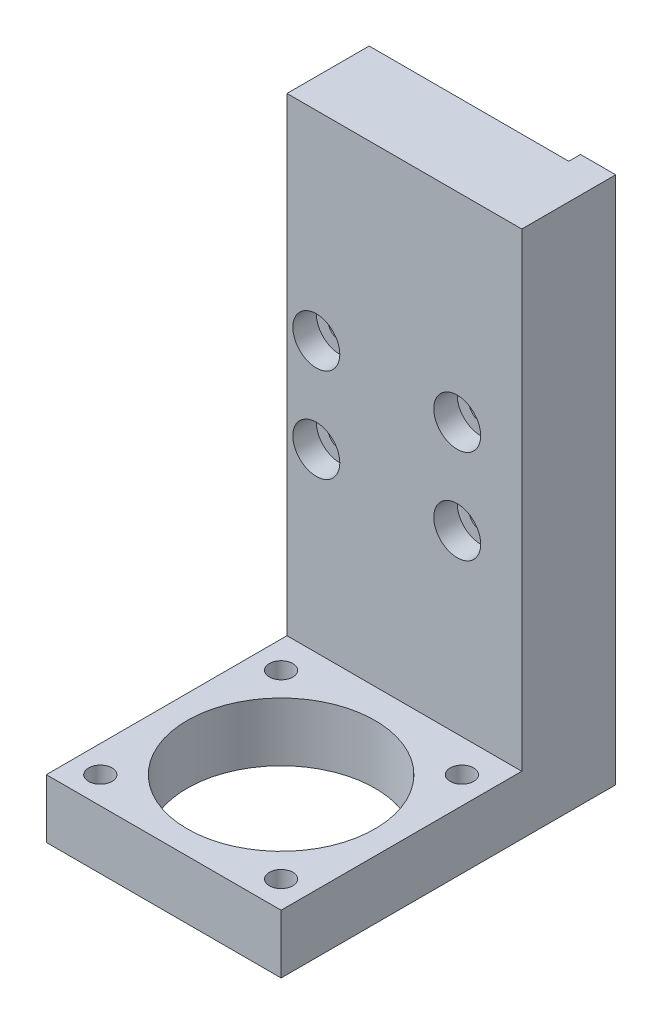
ISO-10303-21;
HEADER;
FILE_DESCRIPTION(('STEP AP214'),'2;1');
FILE_NAME('part.step','',(''),(''),'','','');
FILE_SCHEMA(('AUTOMOTIVE_DESIGN { 1 0 10303 214 1 1 1 1 }'));
ENDSEC;
DATA;
#1=APPLICATION_CONTEXT('core data for automotive mechanical design processes');
#2=APPLICATION_PROTOCOL_DEFINITION('international standard','automotive_design',2000,#1);
#3=PRODUCT_CONTEXT('',#1,'mechanical');
#4=PRODUCT('Part','Part','',(#3));
#5=PRODUCT_RELATED_PRODUCT_CATEGORY('part','',(#4));
#6=PRODUCT_DEFINITION_FORMATION('','',#4);
#7=PRODUCT_DEFINITION_CONTEXT('part definition',#1,'design');
#8=PRODUCT_DEFINITION('design','',#6,#7);
#9=PRODUCT_DEFINITION_SHAPE('','',#8);
#10=(LENGTH_UNIT() NAMED_UNIT(*) SI_UNIT(.MILLI.,.METRE.));
#11=(NAMED_UNIT(*) PLANE_ANGLE_UNIT() SI_UNIT($,.RADIAN.));
#12=(NAMED_UNIT(*) SI_UNIT($,.STERADIAN.) SOLID_ANGLE_UNIT());
#13=UNCERTAINTY_MEASURE_WITH_UNIT(LENGTH_MEASURE(1.E-05),#10,'distance_accuracy_value','');
#14=(GEOMETRIC_REPRESENTATION_CONTEXT(3) GLOBAL_UNCERTAINTY_ASSIGNED_CONTEXT((#13)) GLOBAL_UNIT_ASSIGNED_CONTEXT((#10,
#11,#12)) REPRESENTATION_CONTEXT('',''));
#15=CARTESIAN_POINT('',(0.,0.,0.));
#16=DIRECTION('',(0.,0.,1.));
#17=DIRECTION('',(1.,0.,0.));
#18=AXIS2_PLACEMENT_3D('',#15,#16,#17);
#19=CARTESIAN_POINT('',(2.5,15.,-30.5));
#20=DIRECTION('',(0.,0.,1.));
#21=DIRECTION('',(1.,0.,0.));
#22=AXIS2_PLACEMENT_3D('',#19,#20,#21);
#23=CYLINDRICAL_SURFACE('',#22,1.);
#24=CARTESIAN_POINT('',(2.5,15.,-27.5));
#25=DIRECTION('',(0.,0.,1.));
#26=DIRECTION('',(1.,0.,0.));
#27=AXIS2_PLACEMENT_3D('',#24,#25,#26);
#28=CIRCLE('',#27,1.);
#29=CARTESIAN_POINT('',(3.5,15.,-27.5));
#30=VERTEX_POINT('',#29);
#31=EDGE_CURVE('E237',#30,#30,#28,.F.);
#32=ORIENTED_EDGE('',*,*,#31,.T.);
#33=EDGE_LOOP('',(#32));
#34=FACE_BOUND('',#33,.T.);
#35=CARTESIAN_POINT('',(2.5,15.,-22.5));
#36=DIRECTION('',(0.,0.,1.));
#37=DIRECTION('',(1.,0.,0.));
#38=AXIS2_PLACEMENT_3D('',#35,#36,#37);
#39=CIRCLE('',#38,1.);
#40=CARTESIAN_POINT('',(3.5,15.,-22.5));
#41=VERTEX_POINT('',#40);
#42=EDGE_CURVE('E156',#41,#41,#39,.F.);
#43=ORIENTED_EDGE('',*,*,#42,.F.);
#44=EDGE_LOOP('',(#43));
#45=FACE_BOUND('',#44,.T.);
#46=ADVANCED_FACE('F37',(#34,#45),#23,.F.);
#47=CARTESIAN_POINT('',(2.5,23.,-30.5));
#48=DIRECTION('',(0.,0.,1.));
#49=DIRECTION('',(1.,0.,0.));
#50=AXIS2_PLACEMENT_3D('',#47,#48,#49);
#51=CYLINDRICAL_SURFACE('',#50,1.);
#52=CARTESIAN_POINT('',(2.5,23.,-27.5));
#53=DIRECTION('',(0.,0.,1.));
#54=DIRECTION('',(1.,0.,0.));
#55=AXIS2_PLACEMENT_3D('',#52,#53,#54);
#56=CIRCLE('',#55,1.);
#57=CARTESIAN_POINT('',(3.5,23.,-27.5));
#58=VERTEX_POINT('',#57);
#59=EDGE_CURVE('E234',#58,#58,#56,.F.);
#60=ORIENTED_EDGE('',*,*,#59,.T.);
#61=EDGE_LOOP('',(#60));
#62=FACE_BOUND('',#61,.T.);
#63=CARTESIAN_POINT('',(2.5,23.,-22.5));
#64=DIRECTION('',(0.,0.,1.));
#65=DIRECTION('',(1.,0.,0.));
#66=AXIS2_PLACEMENT_3D('',#63,#64,#65);
#67=CIRCLE('',#66,1.);
#68=CARTESIAN_POINT('',(3.5,23.,-22.5));
#69=VERTEX_POINT('',#68);
#70=EDGE_CURVE('E154',#69,#69,#67,.F.);
#71=ORIENTED_EDGE('',*,*,#70,.F.);
#72=EDGE_LOOP('',(#71));
#73=FACE_BOUND('',#72,.T.);
#74=ADVANCED_FACE('F296',(#62,#73),#51,.F.);
#75=CARTESIAN_POINT('',(14.5,23.,-30.5));
#76=DIRECTION('',(0.,0.,1.));
#77=DIRECTION('',(1.,0.,0.));
#78=AXIS2_PLACEMENT_3D('',#75,#76,#77);
#79=CYLINDRICAL_SURFACE('',#78,1.);
#80=CARTESIAN_POINT('',(14.5,23.,-27.5));
#81=DIRECTION('',(0.,0.,1.));
#82=DIRECTION('',(1.,0.,0.));
#83=AXIS2_PLACEMENT_3D('',#80,#81,#82);
#84=CIRCLE('',#83,1.);
#85=CARTESIAN_POINT('',(15.5,23.,-27.5));
#86=VERTEX_POINT('',#85);
#87=EDGE_CURVE('E226',#86,#86,#84,.F.);
#88=ORIENTED_EDGE('',*,*,#87,.T.);
#89=EDGE_LOOP('',(#88));
#90=FACE_BOUND('',#89,.T.);
#91=CARTESIAN_POINT('',(14.5,23.,-22.5));
#92=DIRECTION('',(0.,0.,1.));
#93=DIRECTION('',(1.,0.,0.));
#94=AXIS2_PLACEMENT_3D('',#91,#92,#93);
#95=CIRCLE('',#94,1.);
#96=CARTESIAN_POINT('',(15.5,23.,-22.5));
#97=VERTEX_POINT('',#96);
#98=EDGE_CURVE('E150',#97,#97,#95,.F.);
#99=ORIENTED_EDGE('',*,*,#98,.F.);
#100=EDGE_LOOP('',(#99));
#101=FACE_BOUND('',#100,.T.);
#102=ADVANCED_FACE('F302',(#90,#101),#79,.F.);
#103=CARTESIAN_POINT('',(14.5,15.,-30.5));
#104=DIRECTION('',(0.,0.,1.));
#105=DIRECTION('',(1.,0.,0.));
#106=AXIS2_PLACEMENT_3D('',#103,#104,#105);
#107=CYLINDRICAL_SURFACE('',#106,1.);
#108=CARTESIAN_POINT('',(14.5,15.,-27.5));
#109=DIRECTION('',(0.,0.,1.));
#110=DIRECTION('',(1.,0.,0.));
#111=AXIS2_PLACEMENT_3D('',#108,#109,#110);
#112=CIRCLE('',#111,1.);
#113=CARTESIAN_POINT('',(15.5,15.,-27.5));
#114=VERTEX_POINT('',#113);
#115=EDGE_CURVE('E223',#114,#114,#112,.F.);
#116=ORIENTED_EDGE('',*,*,#115,.T.);
#117=EDGE_LOOP('',(#116));
#118=FACE_BOUND('',#117,.T.);
#119=CARTESIAN_POINT('',(14.5,15.,-22.5));
#120=DIRECTION('',(0.,0.,1.));
#121=DIRECTION('',(1.,0.,0.));
#122=AXIS2_PLACEMENT_3D('',#119,#120,#121);
#123=CIRCLE('',#122,1.);
#124=CARTESIAN_POINT('',(15.5,15.,-22.5));
#125=VERTEX_POINT('',#124);
#126=EDGE_CURVE('E147',#125,#125,#123,.F.);
#127=ORIENTED_EDGE('',*,*,#126,.F.);
#128=EDGE_LOOP('',(#127));
#129=FACE_BOUND('',#128,.T.);
#130=ADVANCED_FACE('F293',(#118,#129),#107,.F.);
#131=CARTESIAN_POINT('',(20.,-5.,0.));
#132=DIRECTION('',(0.,0.,-1.));
#133=DIRECTION('',(-1.,0.,0.));
#134=AXIS2_PLACEMENT_3D('',#131,#132,#133);
#135=PLANE('',#134);
#136=DIRECTION('',(0.,-1.,0.));
#137=VECTOR('',#136,1.);
#138=CARTESIAN_POINT('',(0.,-5.,0.));
#139=LINE('',#138,#137);
#140=CARTESIAN_POINT('',(0.,0.,0.));
#141=VERTEX_POINT('',#140);
#142=CARTESIAN_POINT('',(0.,-5.,0.));
#143=VERTEX_POINT('',#142);
#144=EDGE_CURVE('E128',#141,#143,#139,.T.);
#145=ORIENTED_EDGE('',*,*,#144,.T.);
#146=DIRECTION('',(-1.,0.,0.));
#147=VECTOR('',#146,1.);
#148=CARTESIAN_POINT('',(20.,-5.,0.));
#149=LINE('',#148,#147);
#150=CARTESIAN_POINT('',(20.,-5.,0.));
#151=VERTEX_POINT('',#150);
#152=EDGE_CURVE('E45',#151,#143,#149,.T.);
#153=ORIENTED_EDGE('',*,*,#152,.F.);
#154=DIRECTION('',(0.,-1.,0.));
#155=VECTOR('',#154,1.);
#156=CARTESIAN_POINT('',(20.,-5.,0.));
#157=LINE('',#156,#155);
#158=CARTESIAN_POINT('',(20.,0.,0.));
#159=VERTEX_POINT('',#158);
#160=EDGE_CURVE('E139',#159,#151,#157,.T.);
#161=ORIENTED_EDGE('',*,*,#160,.F.);
#162=DIRECTION('',(-1.,0.,0.));
#163=VECTOR('',#162,1.);
#164=CARTESIAN_POINT('',(20.,0.,0.));
#165=LINE('',#164,#163);
#166=EDGE_CURVE('E124',#159,#141,#165,.T.);
#167=ORIENTED_EDGE('',*,*,#166,.T.);
#168=EDGE_LOOP('',(#145,#153,#161,#167));
#169=FACE_BOUND('',#168,.T.);
#170=ADVANCED_FACE('F39',(#169),#135,.F.);
#171=CARTESIAN_POINT('',(20.,-5.,-28.5));
#172=DIRECTION('',(0.,1.,0.));
#173=DIRECTION('',(0.,0.,1.));
#174=AXIS2_PLACEMENT_3D('',#171,#172,#173);
#175=PLANE('',#174);
#176=CARTESIAN_POINT('',(2.3,-5.,-2.3));
#177=DIRECTION('',(0.,1.,0.));
#178=DIRECTION('',(0.,0.,1.));
#179=AXIS2_PLACEMENT_3D('',#176,#177,#178);
#180=CIRCLE('',#179,1.);
#181=CARTESIAN_POINT('',(2.3,-5.,-1.3));
#182=VERTEX_POINT('',#181);
#183=EDGE_CURVE('E132',#182,#182,#180,.T.);
#184=ORIENTED_EDGE('',*,*,#183,.T.);
#185=EDGE_LOOP('',(#184));
#186=FACE_BOUND('',#185,.T.);
#187=CARTESIAN_POINT('',(17.7,-5.,-2.3));
#188=DIRECTION('',(0.,1.,0.));
#189=DIRECTION('',(0.,0.,1.));
#190=AXIS2_PLACEMENT_3D('',#187,#188,#189);
#191=CIRCLE('',#190,1.);
#192=CARTESIAN_POINT('',(17.7,-5.,-1.3));
#193=VERTEX_POINT('',#192);
#194=EDGE_CURVE('E184',#193,#193,#191,.T.);
#195=ORIENTED_EDGE('',*,*,#194,.T.);
#196=EDGE_LOOP('',(#195));
#197=FACE_BOUND('',#196,.T.);
#198=CARTESIAN_POINT('',(17.7,-5.,-17.7));
#199=DIRECTION('',(0.,1.,0.));
#200=DIRECTION('',(0.,0.,1.));
#201=AXIS2_PLACEMENT_3D('',#198,#199,#200);
#202=CIRCLE('',#201,1.);
#203=CARTESIAN_POINT('',(17.7,-5.,-16.7));
#204=VERTEX_POINT('',#203);
#205=EDGE_CURVE('E181',#204,#204,#202,.T.);
#206=ORIENTED_EDGE('',*,*,#205,.T.);
#207=EDGE_LOOP('',(#206));
#208=FACE_BOUND('',#207,.T.);
#209=CARTESIAN_POINT('',(2.3,-5.,-17.7));
#210=DIRECTION('',(0.,1.,0.));
#211=DIRECTION('',(0.,0.,1.));
#212=AXIS2_PLACEMENT_3D('',#209,#210,#211);
#213=CIRCLE('',#212,1.);
#214=CARTESIAN_POINT('',(2.3,-5.,-16.7));
#215=VERTEX_POINT('',#214);
#216=EDGE_CURVE('E178',#215,#215,#213,.T.);
#217=ORIENTED_EDGE('',*,*,#216,.T.);
#218=EDGE_LOOP('',(#217));
#219=FACE_BOUND('',#218,.T.);
#220=CARTESIAN_POINT('',(10.,-5.,-10.));
#221=DIRECTION('',(0.,1.,0.));
#222=DIRECTION('',(0.,0.,1.));
#223=AXIS2_PLACEMENT_3D('',#220,#221,#222);
#224=CIRCLE('',#223,8.);
#225=CARTESIAN_POINT('',(10.,-5.,-2.));
#226=VERTEX_POINT('',#225);
#227=EDGE_CURVE('E174',#226,#226,#224,.T.);
#228=ORIENTED_EDGE('',*,*,#227,.T.);
#229=EDGE_LOOP('',(#228));
#230=FACE_BOUND('',#229,.T.);
#231=DIRECTION('',(1.,0.,0.));
#232=VECTOR('',#231,1.);
#233=CARTESIAN_POINT('',(20.,-5.,-27.5));
#234=LINE('',#233,#232);
#235=CARTESIAN_POINT('',(0.,-5.,-27.5));
#236=VERTEX_POINT('',#235);
#237=CARTESIAN_POINT('',(17.,-5.,-27.5));
#238=VERTEX_POINT('',#237);
#239=EDGE_CURVE('E51',#236,#238,#234,.T.);
#240=ORIENTED_EDGE('',*,*,#239,.T.);
#241=DIRECTION('',(0.,0.,-1.));
#242=VECTOR('',#241,1.);
#243=CARTESIAN_POINT('',(17.,-5.,-28.5));
#244=LINE('',#243,#242);
#245=CARTESIAN_POINT('',(17.,-5.,-28.5));
#246=VERTEX_POINT('',#245);
#247=EDGE_CURVE('E195',#238,#246,#244,.T.);
#248=ORIENTED_EDGE('',*,*,#247,.T.);
#249=DIRECTION('',(-1.,0.,0.));
#250=VECTOR('',#249,1.);
#251=CARTESIAN_POINT('',(20.,-5.,-28.5));
#252=LINE('',#251,#250);
#253=CARTESIAN_POINT('',(20.,-5.,-28.5));
#254=VERTEX_POINT('',#253);
#255=EDGE_CURVE('E143',#254,#246,#252,.T.);
#256=ORIENTED_EDGE('',*,*,#255,.F.);
#257=DIRECTION('',(0.,0.,-1.));
#258=VECTOR('',#257,1.);
#259=CARTESIAN_POINT('',(20.,-5.,-28.5));
#260=LINE('',#259,#258);
#261=EDGE_CURVE('E90',#151,#254,#260,.T.);
#262=ORIENTED_EDGE('',*,*,#261,.F.);
#263=ORIENTED_EDGE('',*,*,#152,.T.);
#264=DIRECTION('',(0.,0.,-1.));
#265=VECTOR('',#264,1.);
#266=CARTESIAN_POINT('',(0.,-5.,-28.5));
#267=LINE('',#266,#265);
#268=EDGE_CURVE('E131',#143,#236,#267,.T.);
#269=ORIENTED_EDGE('',*,*,#268,.T.);
#270=EDGE_LOOP('',(#240,#248,#256,#262,#263,#269));
#271=FACE_BOUND('',#270,.T.);
#272=ADVANCED_FACE('F193',(#186,#197,#208,#219,#230,#271),#175,.F.);
#273=CARTESIAN_POINT('',(20.,40.,-28.5));
#274=DIRECTION('',(0.,0.,1.));
#275=DIRECTION('',(0.,-1.,0.));
#276=AXIS2_PLACEMENT_3D('',#273,#274,#275);
#277=PLANE('',#276);
#278=ORIENTED_EDGE('',*,*,#255,.T.);
#279=DIRECTION('',(0.,1.,0.));
#280=VECTOR('',#279,1.);
#281=CARTESIAN_POINT('',(17.,-25.,-28.5));
#282=LINE('',#281,#280);
#283=CARTESIAN_POINT('',(17.,40.,-28.5));
#284=VERTEX_POINT('',#283);
#285=EDGE_CURVE('E201',#246,#284,#282,.T.);
#286=ORIENTED_EDGE('',*,*,#285,.T.);
#287=DIRECTION('',(-1.,0.,0.));
#288=VECTOR('',#287,1.);
#289=CARTESIAN_POINT('',(20.,40.,-28.5));
#290=LINE('',#289,#288);
#291=CARTESIAN_POINT('',(20.,40.,-28.5));
#292=VERTEX_POINT('',#291);
#293=EDGE_CURVE('E119',#292,#284,#290,.T.);
#294=ORIENTED_EDGE('',*,*,#293,.F.);
#295=DIRECTION('',(0.,1.,0.));
#296=VECTOR('',#295,1.);
#297=CARTESIAN_POINT('',(20.,40.,-28.5));
#298=LINE('',#297,#296);
#299=EDGE_CURVE('E106',#254,#292,#298,.T.);
#300=ORIENTED_EDGE('',*,*,#299,.F.);
#301=EDGE_LOOP('',(#278,#286,#294,#300));
#302=FACE_BOUND('',#301,.T.);
#303=ADVANCED_FACE('F198',(#302),#277,.F.);
#304=CARTESIAN_POINT('',(20.,40.,-20.5));
#305=DIRECTION('',(0.,-1.,0.));
#306=DIRECTION('',(0.,0.,-1.));
#307=AXIS2_PLACEMENT_3D('',#304,#305,#306);
#308=PLANE('',#307);
#309=ORIENTED_EDGE('',*,*,#293,.T.);
#310=DIRECTION('',(0.,0.,-1.));
#311=VECTOR('',#310,1.);
#312=CARTESIAN_POINT('',(17.,40.,-28.5));
#313=LINE('',#312,#311);
#314=CARTESIAN_POINT('',(17.,40.,-27.5));
#315=VERTEX_POINT('',#314);
#316=EDGE_CURVE('E205',#315,#284,#313,.T.);
#317=ORIENTED_EDGE('',*,*,#316,.F.);
#318=DIRECTION('',(1.,0.,0.));
#319=VECTOR('',#318,1.);
#320=CARTESIAN_POINT('',(0.,40.,-27.5));
#321=LINE('',#320,#319);
#322=CARTESIAN_POINT('',(0.,40.,-27.5));
#323=VERTEX_POINT('',#322);
#324=EDGE_CURVE('E216',#323,#315,#321,.T.);
#325=ORIENTED_EDGE('',*,*,#324,.F.);
#326=DIRECTION('',(0.,0.,1.));
#327=VECTOR('',#326,1.);
#328=CARTESIAN_POINT('',(0.,40.,-20.5));
#329=LINE('',#328,#327);
#330=CARTESIAN_POINT('',(0.,40.,-20.5));
#331=VERTEX_POINT('',#330);
#332=EDGE_CURVE('E116',#323,#331,#329,.T.);
#333=ORIENTED_EDGE('',*,*,#332,.T.);
#334=DIRECTION('',(-1.,0.,0.));
#335=VECTOR('',#334,1.);
#336=CARTESIAN_POINT('',(20.,40.,-20.5));
#337=LINE('',#336,#335);
#338=CARTESIAN_POINT('',(20.,40.,-20.5));
#339=VERTEX_POINT('',#338);
#340=EDGE_CURVE('E112',#339,#331,#337,.T.);
#341=ORIENTED_EDGE('',*,*,#340,.F.);
#342=DIRECTION('',(0.,0.,1.));
#343=VECTOR('',#342,1.);
#344=CARTESIAN_POINT('',(20.,40.,-20.5));
#345=LINE('',#344,#343);
#346=EDGE_CURVE('E99',#292,#339,#345,.T.);
#347=ORIENTED_EDGE('',*,*,#346,.F.);
#348=EDGE_LOOP('',(#309,#317,#325,#333,#341,#347));
#349=FACE_BOUND('',#348,.T.);
#350=ADVANCED_FACE('F113',(#349),#308,.F.);
#351=CARTESIAN_POINT('',(20.,0.,-20.5));
#352=DIRECTION('',(0.,0.,-1.));
#353=DIRECTION('',(-1.,0.,0.));
#354=AXIS2_PLACEMENT_3D('',#351,#352,#353);
#355=PLANE('',#354);
#356=CARTESIAN_POINT('',(14.5,23.,-20.5));
#357=DIRECTION('',(0.,0.,1.));
#358=DIRECTION('',(1.,0.,0.));
#359=AXIS2_PLACEMENT_3D('',#356,#357,#358);
#360=CIRCLE('',#359,2.00000000000001);
#361=CARTESIAN_POINT('',(16.5,23.,-20.5));
#362=VERTEX_POINT('',#361);
#363=EDGE_CURVE('E255',#362,#362,#360,.T.);
#364=ORIENTED_EDGE('',*,*,#363,.F.);
#365=EDGE_LOOP('',(#364));
#366=FACE_BOUND('',#365,.T.);
#367=CARTESIAN_POINT('',(14.5,15.,-20.5));
#368=DIRECTION('',(0.,0.,1.));
#369=DIRECTION('',(1.,0.,0.));
#370=AXIS2_PLACEMENT_3D('',#367,#368,#369);
#371=CIRCLE('',#370,2.);
#372=CARTESIAN_POINT('',(16.5,15.,-20.5));
#373=VERTEX_POINT('',#372);
#374=EDGE_CURVE('E249',#373,#373,#371,.T.);
#375=ORIENTED_EDGE('',*,*,#374,.F.);
#376=EDGE_LOOP('',(#375));
#377=FACE_BOUND('',#376,.T.);
#378=CARTESIAN_POINT('',(2.5,15.,-20.5));
#379=DIRECTION('',(0.,0.,1.));
#380=DIRECTION('',(1.,0.,0.));
#381=AXIS2_PLACEMENT_3D('',#378,#379,#380);
#382=CIRCLE('',#381,2.);
#383=CARTESIAN_POINT('',(4.5,15.,-20.5));
#384=VERTEX_POINT('',#383);
#385=EDGE_CURVE('E242',#384,#384,#382,.T.);
#386=ORIENTED_EDGE('',*,*,#385,.F.);
#387=EDGE_LOOP('',(#386));
#388=FACE_BOUND('',#387,.T.);
#389=CARTESIAN_POINT('',(2.5,23.,-20.5));
#390=DIRECTION('',(0.,0.,1.));
#391=DIRECTION('',(1.,0.,0.));
#392=AXIS2_PLACEMENT_3D('',#389,#390,#391);
#393=CIRCLE('',#392,2.);
#394=CARTESIAN_POINT('',(4.5,23.,-20.5));
#395=VERTEX_POINT('',#394);
#396=EDGE_CURVE('E245',#395,#395,#393,.T.);
#397=ORIENTED_EDGE('',*,*,#396,.F.);
#398=EDGE_LOOP('',(#397));
#399=FACE_BOUND('',#398,.T.);
#400=DIRECTION('',(0.,-1.,0.));
#401=VECTOR('',#400,1.);
#402=CARTESIAN_POINT('',(0.,0.,-20.5));
#403=LINE('',#402,#401);
#404=CARTESIAN_POINT('',(0.,0.,-20.5));
#405=VERTEX_POINT('',#404);
#406=EDGE_CURVE('E136',#331,#405,#403,.T.);
#407=ORIENTED_EDGE('',*,*,#406,.T.);
#408=DIRECTION('',(-1.,0.,0.));
#409=VECTOR('',#408,1.);
#410=CARTESIAN_POINT('',(20.,0.,-20.5));
#411=LINE('',#410,#409);
#412=CARTESIAN_POINT('',(20.,0.,-20.5));
#413=VERTEX_POINT('',#412);
#414=EDGE_CURVE('E120',#413,#405,#411,.T.);
#415=ORIENTED_EDGE('',*,*,#414,.F.);
#416=DIRECTION('',(0.,-1.,0.));
#417=VECTOR('',#416,1.);
#418=CARTESIAN_POINT('',(20.,0.,-20.5));
#419=LINE('',#418,#417);
#420=EDGE_CURVE('E103',#339,#413,#419,.T.);
#421=ORIENTED_EDGE('',*,*,#420,.F.);
#422=ORIENTED_EDGE('',*,*,#340,.T.);
#423=EDGE_LOOP('',(#407,#415,#421,#422));
#424=FACE_BOUND('',#423,.T.);
#425=ADVANCED_FACE('F122',(#366,#377,#388,#399,#424),#355,.F.);
#426=CARTESIAN_POINT('',(20.,0.,0.));
#427=DIRECTION('',(0.,-1.,0.));
#428=DIRECTION('',(0.,0.,-1.));
#429=AXIS2_PLACEMENT_3D('',#426,#427,#428);
#430=PLANE('',#429);
#431=CARTESIAN_POINT('',(2.3,0.,-2.3));
#432=DIRECTION('',(0.,1.,0.));
#433=DIRECTION('',(0.,0.,1.));
#434=AXIS2_PLACEMENT_3D('',#431,#432,#433);
#435=CIRCLE('',#434,1.);
#436=CARTESIAN_POINT('',(2.3,0.,-1.3));
#437=VERTEX_POINT('',#436);
#438=EDGE_CURVE('E158',#437,#437,#435,.T.);
#439=ORIENTED_EDGE('',*,*,#438,.F.);
#440=EDGE_LOOP('',(#439));
#441=FACE_BOUND('',#440,.T.);
#442=CARTESIAN_POINT('',(17.7,0.,-2.3));
#443=DIRECTION('',(0.,1.,0.));
#444=DIRECTION('',(0.,0.,1.));
#445=AXIS2_PLACEMENT_3D('',#442,#443,#444);
#446=CIRCLE('',#445,1.);
#447=CARTESIAN_POINT('',(17.7,0.,-1.3));
#448=VERTEX_POINT('',#447);
#449=EDGE_CURVE('E162',#448,#448,#446,.T.);
#450=ORIENTED_EDGE('',*,*,#449,.F.);
#451=EDGE_LOOP('',(#450));
#452=FACE_BOUND('',#451,.T.);
#453=CARTESIAN_POINT('',(17.7,0.,-17.7));
#454=DIRECTION('',(0.,1.,0.));
#455=DIRECTION('',(0.,0.,1.));
#456=AXIS2_PLACEMENT_3D('',#453,#454,#455);
#457=CIRCLE('',#456,1.);
#458=CARTESIAN_POINT('',(17.7,0.,-16.7));
#459=VERTEX_POINT('',#458);
#460=EDGE_CURVE('E167',#459,#459,#457,.T.);
#461=ORIENTED_EDGE('',*,*,#460,.F.);
#462=EDGE_LOOP('',(#461));
#463=FACE_BOUND('',#462,.T.);
#464=CARTESIAN_POINT('',(2.3,0.,-17.7));
#465=DIRECTION('',(0.,1.,0.));
#466=DIRECTION('',(0.,0.,1.));
#467=AXIS2_PLACEMENT_3D('',#464,#465,#466);
#468=CIRCLE('',#467,1.);
#469=CARTESIAN_POINT('',(2.3,0.,-16.7));
#470=VERTEX_POINT('',#469);
#471=EDGE_CURVE('E175',#470,#470,#468,.T.);
#472=ORIENTED_EDGE('',*,*,#471,.F.);
#473=EDGE_LOOP('',(#472));
#474=FACE_BOUND('',#473,.T.);
#475=CARTESIAN_POINT('',(10.,0.,-10.));
#476=DIRECTION('',(0.,1.,0.));
#477=DIRECTION('',(0.,0.,1.));
#478=AXIS2_PLACEMENT_3D('',#475,#476,#477);
#479=CIRCLE('',#478,8.);
#480=CARTESIAN_POINT('',(10.,0.,-2.));
#481=VERTEX_POINT('',#480);
#482=EDGE_CURVE('E171',#481,#481,#479,.T.);
#483=ORIENTED_EDGE('',*,*,#482,.F.);
#484=EDGE_LOOP('',(#483));
#485=FACE_BOUND('',#484,.T.);
#486=DIRECTION('',(0.,0.,1.));
#487=VECTOR('',#486,1.);
#488=CARTESIAN_POINT('',(0.,0.,0.));
#489=LINE('',#488,#487);
#490=EDGE_CURVE('E81',#405,#141,#489,.T.);
#491=ORIENTED_EDGE('',*,*,#490,.T.);
#492=ORIENTED_EDGE('',*,*,#166,.F.);
#493=DIRECTION('',(0.,0.,1.));
#494=VECTOR('',#493,1.);
#495=CARTESIAN_POINT('',(20.,0.,0.));
#496=LINE('',#495,#494);
#497=EDGE_CURVE('E60',#413,#159,#496,.T.);
#498=ORIENTED_EDGE('',*,*,#497,.F.);
#499=ORIENTED_EDGE('',*,*,#414,.T.);
#500=EDGE_LOOP('',(#491,#492,#498,#499));
#501=FACE_BOUND('',#500,.T.);
#502=ADVANCED_FACE('F221',(#441,#452,#463,#474,#485,#501),#430,.F.);
#503=CARTESIAN_POINT('',(20.,0.,0.));
#504=DIRECTION('',(-1.,0.,0.));
#505=DIRECTION('',(0.,0.,1.));
#506=AXIS2_PLACEMENT_3D('',#503,#504,#505);
#507=PLANE('',#506);
#508=ORIENTED_EDGE('',*,*,#160,.T.);
#509=ORIENTED_EDGE('',*,*,#261,.T.);
#510=ORIENTED_EDGE('',*,*,#299,.T.);
#511=ORIENTED_EDGE('',*,*,#346,.T.);
#512=ORIENTED_EDGE('',*,*,#420,.T.);
#513=ORIENTED_EDGE('',*,*,#497,.T.);
#514=EDGE_LOOP('',(#508,#509,#510,#511,#512,#513));
#515=FACE_BOUND('',#514,.T.);
#516=ADVANCED_FACE('F101',(#515),#507,.F.);
#517=CARTESIAN_POINT('',(0.,0.,0.));
#518=DIRECTION('',(-1.,0.,0.));
#519=DIRECTION('',(0.,0.,1.));
#520=AXIS2_PLACEMENT_3D('',#517,#518,#519);
#521=PLANE('',#520);
#522=DIRECTION('',(0.,1.,0.));
#523=VECTOR('',#522,1.);
#524=CARTESIAN_POINT('',(0.,0.,-27.5));
#525=LINE('',#524,#523);
#526=EDGE_CURVE('E11',#236,#323,#525,.T.);
#527=ORIENTED_EDGE('',*,*,#526,.F.);
#528=ORIENTED_EDGE('',*,*,#268,.F.);
#529=ORIENTED_EDGE('',*,*,#144,.F.);
#530=ORIENTED_EDGE('',*,*,#490,.F.);
#531=ORIENTED_EDGE('',*,*,#406,.F.);
#532=ORIENTED_EDGE('',*,*,#332,.F.);
#533=EDGE_LOOP('',(#527,#528,#529,#530,#531,#532));
#534=FACE_BOUND('',#533,.T.);
#535=ADVANCED_FACE('F219',(#534),#521,.T.);
#536=CARTESIAN_POINT('',(10.,-10.,-10.));
#537=DIRECTION('',(0.,1.,0.));
#538=DIRECTION('',(0.,0.,1.));
#539=AXIS2_PLACEMENT_3D('',#536,#537,#538);
#540=CYLINDRICAL_SURFACE('',#539,8.);
#541=ORIENTED_EDGE('',*,*,#482,.T.);
#542=EDGE_LOOP('',(#541));
#543=FACE_BOUND('',#542,.T.);
#544=ORIENTED_EDGE('',*,*,#227,.F.);
#545=EDGE_LOOP('',(#544));
#546=FACE_BOUND('',#545,.T.);
#547=ADVANCED_FACE('F279',(#543,#546),#540,.F.);
#548=CARTESIAN_POINT('',(2.3,-10.,-17.7));
#549=DIRECTION('',(0.,1.,0.));
#550=DIRECTION('',(0.,0.,1.));
#551=AXIS2_PLACEMENT_3D('',#548,#549,#550);
#552=CYLINDRICAL_SURFACE('',#551,1.);
#553=ORIENTED_EDGE('',*,*,#471,.T.);
#554=EDGE_LOOP('',(#553));
#555=FACE_BOUND('',#554,.T.);
#556=ORIENTED_EDGE('',*,*,#216,.F.);
#557=EDGE_LOOP('',(#556));
#558=FACE_BOUND('',#557,.T.);
#559=ADVANCED_FACE('F282',(#555,#558),#552,.F.);
#560=CARTESIAN_POINT('',(17.7,-10.,-17.7));
#561=DIRECTION('',(0.,1.,0.));
#562=DIRECTION('',(0.,0.,1.));
#563=AXIS2_PLACEMENT_3D('',#560,#561,#562);
#564=CYLINDRICAL_SURFACE('',#563,1.);
#565=ORIENTED_EDGE('',*,*,#460,.T.);
#566=EDGE_LOOP('',(#565));
#567=FACE_BOUND('',#566,.T.);
#568=ORIENTED_EDGE('',*,*,#205,.F.);
#569=EDGE_LOOP('',(#568));
#570=FACE_BOUND('',#569,.T.);
#571=ADVANCED_FACE('F268',(#567,#570),#564,.F.);
#572=CARTESIAN_POINT('',(17.7,-10.,-2.3));
#573=DIRECTION('',(0.,1.,0.));
#574=DIRECTION('',(0.,0.,1.));
#575=AXIS2_PLACEMENT_3D('',#572,#573,#574);
#576=CYLINDRICAL_SURFACE('',#575,1.);
#577=ORIENTED_EDGE('',*,*,#449,.T.);
#578=EDGE_LOOP('',(#577));
#579=FACE_BOUND('',#578,.T.);
#580=ORIENTED_EDGE('',*,*,#194,.F.);
#581=EDGE_LOOP('',(#580));
#582=FACE_BOUND('',#581,.T.);
#583=ADVANCED_FACE('F314',(#579,#582),#576,.F.);
#584=CARTESIAN_POINT('',(2.3,-10.,-2.3));
#585=DIRECTION('',(0.,1.,0.));
#586=DIRECTION('',(0.,0.,1.));
#587=AXIS2_PLACEMENT_3D('',#584,#585,#586);
#588=CYLINDRICAL_SURFACE('',#587,1.);
#589=ORIENTED_EDGE('',*,*,#438,.T.);
#590=EDGE_LOOP('',(#589));
#591=FACE_BOUND('',#590,.T.);
#592=ORIENTED_EDGE('',*,*,#183,.F.);
#593=EDGE_LOOP('',(#592));
#594=FACE_BOUND('',#593,.T.);
#595=ADVANCED_FACE('F317',(#591,#594),#588,.F.);
#596=CARTESIAN_POINT('',(14.5,15.,-22.5));
#597=DIRECTION('',(0.,0.,1.));
#598=DIRECTION('',(1.,0.,0.));
#599=AXIS2_PLACEMENT_3D('',#596,#597,#598);
#600=PLANE('',#599);
#601=CARTESIAN_POINT('',(14.5,15.,-22.5));
#602=DIRECTION('',(0.,0.,1.));
#603=DIRECTION('',(1.,0.,0.));
#604=AXIS2_PLACEMENT_3D('',#601,#602,#603);
#605=CIRCLE('',#604,2.);
#606=CARTESIAN_POINT('',(16.5,15.,-22.5));
#607=VERTEX_POINT('',#606);
#608=EDGE_CURVE('E252',#607,#607,#605,.T.);
#609=ORIENTED_EDGE('',*,*,#608,.T.);
#610=EDGE_LOOP('',(#609));
#611=FACE_BOUND('',#610,.T.);
#612=ORIENTED_EDGE('',*,*,#126,.T.);
#613=EDGE_LOOP('',(#612));
#614=FACE_BOUND('',#613,.T.);
#615=ADVANCED_FACE('F320',(#611,#614),#600,.T.);
#616=CARTESIAN_POINT('',(14.5,15.,-22.5));
#617=DIRECTION('',(0.,0.,1.));
#618=DIRECTION('',(1.,0.,0.));
#619=AXIS2_PLACEMENT_3D('',#616,#617,#618);
#620=CYLINDRICAL_SURFACE('',#619,2.);
#621=ORIENTED_EDGE('',*,*,#608,.F.);
#622=EDGE_LOOP('',(#621));
#623=FACE_BOUND('',#622,.T.);
#624=ORIENTED_EDGE('',*,*,#374,.T.);
#625=EDGE_LOOP('',(#624));
#626=FACE_BOUND('',#625,.T.);
#627=ADVANCED_FACE('F378',(#623,#626),#620,.F.);
#628=CARTESIAN_POINT('',(14.5,23.,-22.5));
#629=DIRECTION('',(0.,0.,1.));
#630=DIRECTION('',(1.,0.,0.));
#631=AXIS2_PLACEMENT_3D('',#628,#629,#630);
#632=PLANE('',#631);
#633=CARTESIAN_POINT('',(14.5,23.,-22.5));
#634=DIRECTION('',(0.,0.,1.));
#635=DIRECTION('',(1.,0.,0.));
#636=AXIS2_PLACEMENT_3D('',#633,#634,#635);
#637=CIRCLE('',#636,2.00000000000001);
#638=CARTESIAN_POINT('',(16.5,23.,-22.5));
#639=VERTEX_POINT('',#638);
#640=EDGE_CURVE('E241',#639,#639,#637,.T.);
#641=ORIENTED_EDGE('',*,*,#640,.T.);
#642=EDGE_LOOP('',(#641));
#643=FACE_BOUND('',#642,.T.);
#644=ORIENTED_EDGE('',*,*,#98,.T.);
#645=EDGE_LOOP('',(#644));
#646=FACE_BOUND('',#645,.T.);
#647=ADVANCED_FACE('F386',(#643,#646),#632,.T.);
#648=CARTESIAN_POINT('',(14.5,23.,-22.5));
#649=DIRECTION('',(0.,0.,1.));
#650=DIRECTION('',(1.,0.,0.));
#651=AXIS2_PLACEMENT_3D('',#648,#649,#650);
#652=CYLINDRICAL_SURFACE('',#651,2.00000000000001);
#653=ORIENTED_EDGE('',*,*,#640,.F.);
#654=EDGE_LOOP('',(#653));
#655=FACE_BOUND('',#654,.T.);
#656=ORIENTED_EDGE('',*,*,#363,.T.);
#657=EDGE_LOOP('',(#656));
#658=FACE_BOUND('',#657,.T.);
#659=ADVANCED_FACE('F394',(#655,#658),#652,.F.);
#660=CARTESIAN_POINT('',(2.5,23.,-22.5));
#661=DIRECTION('',(0.,0.,1.));
#662=DIRECTION('',(1.,0.,0.));
#663=AXIS2_PLACEMENT_3D('',#660,#661,#662);
#664=PLANE('',#663);
#665=CARTESIAN_POINT('',(2.5,23.,-22.5));
#666=DIRECTION('',(0.,0.,1.));
#667=DIRECTION('',(1.,0.,0.));
#668=AXIS2_PLACEMENT_3D('',#665,#666,#667);
#669=CIRCLE('',#668,2.);
#670=CARTESIAN_POINT('',(4.5,23.,-22.5));
#671=VERTEX_POINT('',#670);
#672=EDGE_CURVE('E151',#671,#671,#669,.T.);
#673=ORIENTED_EDGE('',*,*,#672,.T.);
#674=EDGE_LOOP('',(#673));
#675=FACE_BOUND('',#674,.T.);
#676=ORIENTED_EDGE('',*,*,#70,.T.);
#677=EDGE_LOOP('',(#676));
#678=FACE_BOUND('',#677,.T.);
#679=ADVANCED_FACE('F402',(#675,#678),#664,.T.);
#680=CARTESIAN_POINT('',(2.5,23.,-22.5));
#681=DIRECTION('',(0.,0.,1.));
#682=DIRECTION('',(1.,0.,0.));
#683=AXIS2_PLACEMENT_3D('',#680,#681,#682);
#684=CYLINDRICAL_SURFACE('',#683,2.);
#685=ORIENTED_EDGE('',*,*,#672,.F.);
#686=EDGE_LOOP('',(#685));
#687=FACE_BOUND('',#686,.T.);
#688=ORIENTED_EDGE('',*,*,#396,.T.);
#689=EDGE_LOOP('',(#688));
#690=FACE_BOUND('',#689,.T.);
#691=ADVANCED_FACE('F410',(#687,#690),#684,.F.);
#692=CARTESIAN_POINT('',(2.5,15.,-22.5));
#693=DIRECTION('',(0.,0.,1.));
#694=DIRECTION('',(1.,0.,0.));
#695=AXIS2_PLACEMENT_3D('',#692,#693,#694);
#696=PLANE('',#695);
#697=CARTESIAN_POINT('',(2.5,15.,-22.5));
#698=DIRECTION('',(0.,0.,1.));
#699=DIRECTION('',(1.,0.,0.));
#700=AXIS2_PLACEMENT_3D('',#697,#698,#699);
#701=CIRCLE('',#700,2.);
#702=CARTESIAN_POINT('',(4.5,15.,-22.5));
#703=VERTEX_POINT('',#702);
#704=EDGE_CURVE('E246',#703,#703,#701,.T.);
#705=ORIENTED_EDGE('',*,*,#704,.T.);
#706=EDGE_LOOP('',(#705));
#707=FACE_BOUND('',#706,.T.);
#708=ORIENTED_EDGE('',*,*,#42,.T.);
#709=EDGE_LOOP('',(#708));
#710=FACE_BOUND('',#709,.T.);
#711=ADVANCED_FACE('F418',(#707,#710),#696,.T.);
#712=CARTESIAN_POINT('',(2.5,15.,-22.5));
#713=DIRECTION('',(0.,0.,1.));
#714=DIRECTION('',(1.,0.,0.));
#715=AXIS2_PLACEMENT_3D('',#712,#713,#714);
#716=CYLINDRICAL_SURFACE('',#715,2.);
#717=ORIENTED_EDGE('',*,*,#704,.F.);
#718=EDGE_LOOP('',(#717));
#719=FACE_BOUND('',#718,.T.);
#720=ORIENTED_EDGE('',*,*,#385,.T.);
#721=EDGE_LOOP('',(#720));
#722=FACE_BOUND('',#721,.T.);
#723=ADVANCED_FACE('F426',(#719,#722),#716,.F.);
#724=CARTESIAN_POINT('',(17.,-25.,-28.5));
#725=DIRECTION('',(1.,0.,0.));
#726=DIRECTION('',(0.,0.,-1.));
#727=AXIS2_PLACEMENT_3D('',#724,#725,#726);
#728=PLANE('',#727);
#729=DIRECTION('',(0.,1.,0.));
#730=VECTOR('',#729,1.);
#731=CARTESIAN_POINT('',(17.,-25.,-27.5));
#732=LINE('',#731,#730);
#733=EDGE_CURVE('E228',#238,#315,#732,.T.);
#734=ORIENTED_EDGE('',*,*,#733,.T.);
#735=ORIENTED_EDGE('',*,*,#316,.T.);
#736=ORIENTED_EDGE('',*,*,#285,.F.);
#737=ORIENTED_EDGE('',*,*,#247,.F.);
#738=EDGE_LOOP('',(#734,#735,#736,#737));
#739=FACE_BOUND('',#738,.T.);
#740=ADVANCED_FACE('F434',(#739),#728,.F.);
#741=CARTESIAN_POINT('',(0.,-25.,-27.5));
#742=DIRECTION('',(0.,0.,1.));
#743=DIRECTION('',(1.,0.,0.));
#744=AXIS2_PLACEMENT_3D('',#741,#742,#743);
#745=PLANE('',#744);
#746=ORIENTED_EDGE('',*,*,#59,.F.);
#747=EDGE_LOOP('',(#746));
#748=FACE_BOUND('',#747,.T.);
#749=ORIENTED_EDGE('',*,*,#115,.F.);
#750=EDGE_LOOP('',(#749));
#751=FACE_BOUND('',#750,.T.);
#752=ORIENTED_EDGE('',*,*,#526,.T.);
#753=ORIENTED_EDGE('',*,*,#324,.T.);
#754=ORIENTED_EDGE('',*,*,#733,.F.);
#755=ORIENTED_EDGE('',*,*,#239,.F.);
#756=EDGE_LOOP('',(#752,#753,#754,#755));
#757=FACE_BOUND('',#756,.T.);
#758=ORIENTED_EDGE('',*,*,#87,.F.);
#759=EDGE_LOOP('',(#758));
#760=FACE_BOUND('',#759,.T.);
#761=ORIENTED_EDGE('',*,*,#31,.F.);
#762=EDGE_LOOP('',(#761));
#763=FACE_BOUND('',#762,.T.);
#764=ADVANCED_FACE('F214',(#748,#751,#757,#760,#763),#745,.F.);
#765=CLOSED_SHELL('',(#46,#74,#102,#130,#170,#272,#303,#350,#425,#502,#516,#535,#547,#559,#571,
#583,#595,#615,#627,#647,#659,#679,#691,#711,#723,#740,#764));
#766=MANIFOLD_SOLID_BREP('B2',#765);
#767=ADVANCED_BREP_SHAPE_REPRESENTATION('',(#18,#766),#14);
#768=SHAPE_DEFINITION_REPRESENTATION(#9,#767);
ENDSEC;
END-ISO-10303-21;
